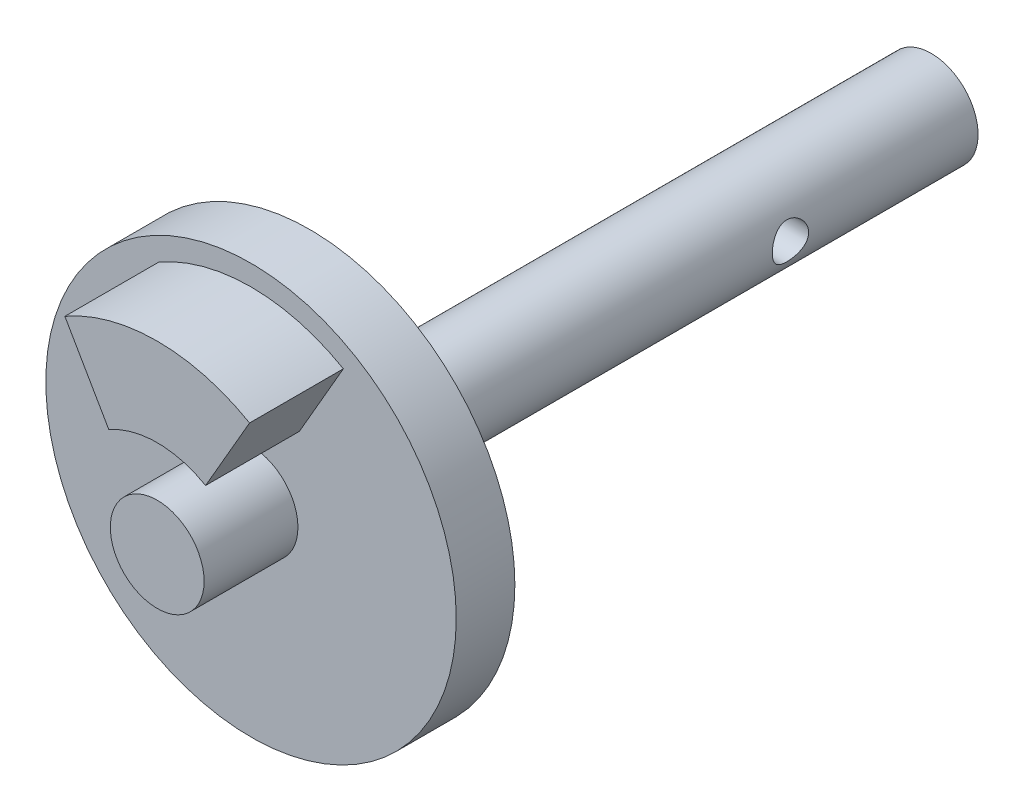
ISO-10303-21;
HEADER;
FILE_DESCRIPTION(('STEP AP214'),'2;1');
FILE_NAME('part.step','',(''),(''),'','','');
FILE_SCHEMA(('AUTOMOTIVE_DESIGN { 1 0 10303 214 1 1 1 1 }'));
ENDSEC;
DATA;
#1=APPLICATION_CONTEXT('core data for automotive mechanical design processes');
#2=APPLICATION_PROTOCOL_DEFINITION('international standard','automotive_design',2000,#1);
#3=PRODUCT_CONTEXT('',#1,'mechanical');
#4=PRODUCT('Part','Part','',(#3));
#5=PRODUCT_RELATED_PRODUCT_CATEGORY('part','',(#4));
#6=PRODUCT_DEFINITION_FORMATION('','',#4);
#7=PRODUCT_DEFINITION_CONTEXT('part definition',#1,'design');
#8=PRODUCT_DEFINITION('design','',#6,#7);
#9=PRODUCT_DEFINITION_SHAPE('','',#8);
#10=(LENGTH_UNIT() NAMED_UNIT(*) SI_UNIT(.MILLI.,.METRE.));
#11=(NAMED_UNIT(*) PLANE_ANGLE_UNIT() SI_UNIT($,.RADIAN.));
#12=(NAMED_UNIT(*) SI_UNIT($,.STERADIAN.) SOLID_ANGLE_UNIT());
#13=UNCERTAINTY_MEASURE_WITH_UNIT(LENGTH_MEASURE(1.E-05),#10,'distance_accuracy_value','');
#14=(GEOMETRIC_REPRESENTATION_CONTEXT(3) GLOBAL_UNCERTAINTY_ASSIGNED_CONTEXT((#13)) GLOBAL_UNIT_ASSIGNED_CONTEXT((#10,
#11,#12)) REPRESENTATION_CONTEXT('',''));
#15=CARTESIAN_POINT('',(0.,0.,0.));
#16=DIRECTION('',(0.,0.,1.));
#17=DIRECTION('',(1.,0.,0.));
#18=AXIS2_PLACEMENT_3D('',#15,#16,#17);
#19=CARTESIAN_POINT('',(0.,0.,2.5));
#20=DIRECTION('',(0.,0.,1.));
#21=DIRECTION('',(1.,0.,0.));
#22=AXIS2_PLACEMENT_3D('',#19,#20,#21);
#23=PLANE('',#22);
#24=CARTESIAN_POINT('',(0.,0.,2.5));
#25=DIRECTION('',(0.,0.,1.));
#26=DIRECTION('',(1.,0.,0.));
#27=AXIS2_PLACEMENT_3D('',#24,#25,#26);
#28=CIRCLE('',#27,4.);
#29=CARTESIAN_POINT('',(4.,0.,2.5));
#30=VERTEX_POINT('',#29);
#31=EDGE_CURVE('E188',#30,#30,#28,.T.);
#32=ORIENTED_EDGE('',*,*,#31,.F.);
#33=EDGE_LOOP('',(#32));
#34=FACE_BOUND('',#33,.T.);
#35=CARTESIAN_POINT('',(0.,0.,2.5));
#36=DIRECTION('',(0.,0.,1.));
#37=DIRECTION('',(1.,0.,0.));
#38=AXIS2_PLACEMENT_3D('',#35,#36,#37);
#39=CIRCLE('',#38,17.5);
#40=CARTESIAN_POINT('',(17.5,0.,2.5));
#41=VERTEX_POINT('',#40);
#42=EDGE_CURVE('E47',#41,#41,#39,.T.);
#43=ORIENTED_EDGE('',*,*,#42,.T.);
#44=EDGE_LOOP('',(#43));
#45=FACE_BOUND('',#44,.T.);
#46=DIRECTION('',(0.499999999999996,-0.866025403784441,0.));
#47=VECTOR('',#46,1.);
#48=CARTESIAN_POINT('',(-4.12499999999996,7.14470958122165,2.5));
#49=LINE('',#48,#47);
#50=CARTESIAN_POINT('',(-7.87499999999993,13.639900109605,2.5));
#51=VERTEX_POINT('',#50);
#52=CARTESIAN_POINT('',(-4.12499999999996,7.14470958122165,2.5));
#53=VERTEX_POINT('',#52);
#54=EDGE_CURVE('E96',#51,#53,#49,.T.);
#55=ORIENTED_EDGE('',*,*,#54,.F.);
#56=CARTESIAN_POINT('',(0.,0.,2.5));
#57=DIRECTION('',(0.,0.,1.));
#58=DIRECTION('',(-1.,0.,0.));
#59=AXIS2_PLACEMENT_3D('',#56,#57,#58);
#60=CIRCLE('',#59,15.75);
#61=CARTESIAN_POINT('',(7.87499999999993,13.639900109605,2.5));
#62=VERTEX_POINT('',#61);
#63=EDGE_CURVE('E107',#62,#51,#60,.T.);
#64=ORIENTED_EDGE('',*,*,#63,.F.);
#65=DIRECTION('',(0.499999999999995,0.866025403784441,0.));
#66=VECTOR('',#65,1.);
#67=CARTESIAN_POINT('',(7.87499999999993,13.639900109605,2.5));
#68=LINE('',#67,#66);
#69=CARTESIAN_POINT('',(4.12499999999996,7.14470958122164,2.5));
#70=VERTEX_POINT('',#69);
#71=EDGE_CURVE('E77',#70,#62,#68,.T.);
#72=ORIENTED_EDGE('',*,*,#71,.F.);
#73=CARTESIAN_POINT('',(0.,0.,2.5));
#74=DIRECTION('',(0.,0.,-1.));
#75=DIRECTION('',(1.,0.,0.));
#76=AXIS2_PLACEMENT_3D('',#73,#74,#75);
#77=CIRCLE('',#76,8.25);
#78=EDGE_CURVE('E112',#53,#70,#77,.T.);
#79=ORIENTED_EDGE('',*,*,#78,.F.);
#80=EDGE_LOOP('',(#55,#64,#72,#79));
#81=FACE_BOUND('',#80,.T.);
#82=ADVANCED_FACE('F38',(#34,#45,#81),#23,.T.);
#83=CARTESIAN_POINT('',(0.,0.,2.5));
#84=DIRECTION('',(0.,0.,-1.));
#85=DIRECTION('',(-1.,0.,0.));
#86=AXIS2_PLACEMENT_3D('',#83,#84,#85);
#87=CYLINDRICAL_SURFACE('',#86,17.5);
#88=ORIENTED_EDGE('',*,*,#42,.F.);
#89=EDGE_LOOP('',(#88));
#90=FACE_BOUND('',#89,.T.);
#91=CARTESIAN_POINT('',(0.,0.,-2.5));
#92=DIRECTION('',(0.,0.,1.));
#93=DIRECTION('',(1.,0.,0.));
#94=AXIS2_PLACEMENT_3D('',#91,#92,#93);
#95=CIRCLE('',#94,17.5);
#96=CARTESIAN_POINT('',(17.5,0.,-2.5));
#97=VERTEX_POINT('',#96);
#98=EDGE_CURVE('E42',#97,#97,#95,.T.);
#99=ORIENTED_EDGE('',*,*,#98,.T.);
#100=EDGE_LOOP('',(#99));
#101=FACE_BOUND('',#100,.T.);
#102=ADVANCED_FACE('F40',(#90,#101),#87,.T.);
#103=CARTESIAN_POINT('',(0.,0.,-2.5));
#104=DIRECTION('',(0.,0.,1.));
#105=DIRECTION('',(1.,0.,0.));
#106=AXIS2_PLACEMENT_3D('',#103,#104,#105);
#107=PLANE('',#106);
#108=CARTESIAN_POINT('',(0.,0.,-2.5));
#109=DIRECTION('',(0.,0.,-1.));
#110=DIRECTION('',(-1.,0.,0.));
#111=AXIS2_PLACEMENT_3D('',#108,#109,#110);
#112=CIRCLE('',#111,4.);
#113=CARTESIAN_POINT('',(-4.,0.,-2.5));
#114=VERTEX_POINT('',#113);
#115=EDGE_CURVE('E11',#114,#114,#112,.T.);
#116=ORIENTED_EDGE('',*,*,#115,.F.);
#117=EDGE_LOOP('',(#116));
#118=FACE_BOUND('',#117,.T.);
#119=ORIENTED_EDGE('',*,*,#98,.F.);
#120=EDGE_LOOP('',(#119));
#121=FACE_BOUND('',#120,.T.);
#122=ADVANCED_FACE('F124',(#118,#121),#107,.F.);
#123=CARTESIAN_POINT('',(0.,0.,10.5));
#124=DIRECTION('',(0.,0.,-1.));
#125=DIRECTION('',(-1.,0.,0.));
#126=AXIS2_PLACEMENT_3D('',#123,#124,#125);
#127=CYLINDRICAL_SURFACE('',#126,15.75);
#128=ORIENTED_EDGE('',*,*,#63,.T.);
#129=DIRECTION('',(0.,0.,-1.));
#130=VECTOR('',#129,1.);
#131=CARTESIAN_POINT('',(-7.87499999999993,13.639900109605,10.5));
#132=LINE('',#131,#130);
#133=CARTESIAN_POINT('',(-7.87499999999993,13.639900109605,10.5));
#134=VERTEX_POINT('',#133);
#135=EDGE_CURVE('E99',#134,#51,#132,.T.);
#136=ORIENTED_EDGE('',*,*,#135,.F.);
#137=CARTESIAN_POINT('',(0.,0.,10.5));
#138=DIRECTION('',(0.,0.,1.));
#139=DIRECTION('',(-1.,0.,0.));
#140=AXIS2_PLACEMENT_3D('',#137,#138,#139);
#141=CIRCLE('',#140,15.75);
#142=CARTESIAN_POINT('',(7.87499999999993,13.639900109605,10.5));
#143=VERTEX_POINT('',#142);
#144=EDGE_CURVE('E89',#143,#134,#141,.T.);
#145=ORIENTED_EDGE('',*,*,#144,.F.);
#146=DIRECTION('',(0.,0.,-1.));
#147=VECTOR('',#146,1.);
#148=CARTESIAN_POINT('',(7.87499999999993,13.639900109605,10.5));
#149=LINE('',#148,#147);
#150=EDGE_CURVE('E103',#143,#62,#149,.T.);
#151=ORIENTED_EDGE('',*,*,#150,.T.);
#152=EDGE_LOOP('',(#128,#136,#145,#151));
#153=FACE_BOUND('',#152,.T.);
#154=ADVANCED_FACE('F126',(#153),#127,.T.);
#155=CARTESIAN_POINT('',(-4.12499999999996,7.14470958122165,10.5));
#156=DIRECTION('',(0.866025403784441,0.499999999999996,0.));
#157=DIRECTION('',(-0.499999999999996,0.866025403784441,0.));
#158=AXIS2_PLACEMENT_3D('',#155,#156,#157);
#159=PLANE('',#158);
#160=ORIENTED_EDGE('',*,*,#54,.T.);
#161=DIRECTION('',(0.,0.,-1.));
#162=VECTOR('',#161,1.);
#163=CARTESIAN_POINT('',(-4.12499999999996,7.14470958122165,10.5));
#164=LINE('',#163,#162);
#165=CARTESIAN_POINT('',(-4.12499999999996,7.14470958122165,10.5));
#166=VERTEX_POINT('',#165);
#167=EDGE_CURVE('E93',#166,#53,#164,.T.);
#168=ORIENTED_EDGE('',*,*,#167,.F.);
#169=DIRECTION('',(0.499999999999996,-0.866025403784441,0.));
#170=VECTOR('',#169,1.);
#171=CARTESIAN_POINT('',(-4.12499999999996,7.14470958122165,10.5));
#172=LINE('',#171,#170);
#173=EDGE_CURVE('E84',#134,#166,#172,.T.);
#174=ORIENTED_EDGE('',*,*,#173,.F.);
#175=ORIENTED_EDGE('',*,*,#135,.T.);
#176=EDGE_LOOP('',(#160,#168,#174,#175));
#177=FACE_BOUND('',#176,.T.);
#178=ADVANCED_FACE('F94',(#177),#159,.F.);
#179=CARTESIAN_POINT('',(0.,0.,10.5));
#180=DIRECTION('',(0.,0.,-1.));
#181=DIRECTION('',(-1.,0.,0.));
#182=AXIS2_PLACEMENT_3D('',#179,#180,#181);
#183=CYLINDRICAL_SURFACE('',#182,8.25);
#184=ORIENTED_EDGE('',*,*,#78,.T.);
#185=DIRECTION('',(0.,0.,-1.));
#186=VECTOR('',#185,1.);
#187=CARTESIAN_POINT('',(4.12499999999996,7.14470958122164,10.5));
#188=LINE('',#187,#186);
#189=CARTESIAN_POINT('',(4.12499999999996,7.14470958122164,10.5));
#190=VERTEX_POINT('',#189);
#191=EDGE_CURVE('E55',#190,#70,#188,.T.);
#192=ORIENTED_EDGE('',*,*,#191,.F.);
#193=CARTESIAN_POINT('',(0.,0.,10.5));
#194=DIRECTION('',(0.,0.,-1.));
#195=DIRECTION('',(1.,0.,0.));
#196=AXIS2_PLACEMENT_3D('',#193,#194,#195);
#197=CIRCLE('',#196,8.25);
#198=EDGE_CURVE('E87',#166,#190,#197,.T.);
#199=ORIENTED_EDGE('',*,*,#198,.F.);
#200=ORIENTED_EDGE('',*,*,#167,.T.);
#201=EDGE_LOOP('',(#184,#192,#199,#200));
#202=FACE_BOUND('',#201,.T.);
#203=ADVANCED_FACE('F101',(#202),#183,.F.);
#204=CARTESIAN_POINT('',(7.87499999999993,13.639900109605,10.5));
#205=DIRECTION('',(-0.866025403784441,0.499999999999995,0.));
#206=DIRECTION('',(-0.499999999999995,-0.866025403784441,0.));
#207=AXIS2_PLACEMENT_3D('',#204,#205,#206);
#208=PLANE('',#207);
#209=ORIENTED_EDGE('',*,*,#71,.T.);
#210=ORIENTED_EDGE('',*,*,#150,.F.);
#211=DIRECTION('',(0.499999999999995,0.866025403784441,0.));
#212=VECTOR('',#211,1.);
#213=CARTESIAN_POINT('',(7.87499999999993,13.639900109605,10.5));
#214=LINE('',#213,#212);
#215=EDGE_CURVE('E63',#190,#143,#214,.T.);
#216=ORIENTED_EDGE('',*,*,#215,.F.);
#217=ORIENTED_EDGE('',*,*,#191,.T.);
#218=EDGE_LOOP('',(#209,#210,#216,#217));
#219=FACE_BOUND('',#218,.T.);
#220=ADVANCED_FACE('F147',(#219),#208,.F.);
#221=CARTESIAN_POINT('',(0.,0.,10.5));
#222=DIRECTION('',(0.,0.,-1.));
#223=DIRECTION('',(-1.,0.,0.));
#224=AXIS2_PLACEMENT_3D('',#221,#222,#223);
#225=PLANE('',#224);
#226=ORIENTED_EDGE('',*,*,#144,.T.);
#227=ORIENTED_EDGE('',*,*,#173,.T.);
#228=ORIENTED_EDGE('',*,*,#198,.T.);
#229=ORIENTED_EDGE('',*,*,#215,.T.);
#230=EDGE_LOOP('',(#226,#227,#228,#229));
#231=FACE_BOUND('',#230,.T.);
#232=ADVANCED_FACE('F85',(#231),#225,.F.);
#233=CARTESIAN_POINT('',(0.,0.,10.5));
#234=DIRECTION('',(0.,0.,-1.));
#235=DIRECTION('',(-1.,0.,0.));
#236=AXIS2_PLACEMENT_3D('',#233,#234,#235);
#237=CYLINDRICAL_SURFACE('',#236,4.);
#238=CARTESIAN_POINT('',(0.,0.,10.5));
#239=DIRECTION('',(0.,0.,1.));
#240=DIRECTION('',(1.,0.,0.));
#241=AXIS2_PLACEMENT_3D('',#238,#239,#240);
#242=CIRCLE('',#241,4.);
#243=CARTESIAN_POINT('',(4.,0.,10.5));
#244=VERTEX_POINT('',#243);
#245=EDGE_CURVE('E110',#244,#244,#242,.T.);
#246=ORIENTED_EDGE('',*,*,#245,.F.);
#247=EDGE_LOOP('',(#246));
#248=FACE_BOUND('',#247,.T.);
#249=ORIENTED_EDGE('',*,*,#31,.T.);
#250=EDGE_LOOP('',(#249));
#251=FACE_BOUND('',#250,.T.);
#252=ADVANCED_FACE('F152',(#248,#251),#237,.T.);
#253=CARTESIAN_POINT('',(0.,0.,10.5));
#254=DIRECTION('',(0.,0.,1.));
#255=DIRECTION('',(1.,0.,0.));
#256=AXIS2_PLACEMENT_3D('',#253,#254,#255);
#257=PLANE('',#256);
#258=ORIENTED_EDGE('',*,*,#245,.T.);
#259=EDGE_LOOP('',(#258));
#260=FACE_BOUND('',#259,.T.);
#261=ADVANCED_FACE('F155',(#260),#257,.T.);
#262=CARTESIAN_POINT('',(0.,0.,-55.5));
#263=DIRECTION('',(0.,0.,1.));
#264=DIRECTION('',(1.,0.,0.));
#265=AXIS2_PLACEMENT_3D('',#262,#263,#264);
#266=CYLINDRICAL_SURFACE('',#265,4.);
#267=CARTESIAN_POINT('',(4.,0.,-37.95));
#268=CARTESIAN_POINT('',(4.00000307103966,-0.0837418170105693,-37.9499959912669));
#269=CARTESIAN_POINT('',(3.9973478314409,-0.167457172373491,-37.9568073370164));
#270=CARTESIAN_POINT('',(3.98702237503302,-0.332375207740033,-37.9837535651346));
#271=CARTESIAN_POINT('',(3.97935324557983,-0.413578428549003,-38.0038855586827));
#272=CARTESIAN_POINT('',(3.95981985493208,-0.571068953775959,-38.0566468806909));
#273=CARTESIAN_POINT('',(3.94796402326925,-0.647365774547914,-38.0892511083804));
#274=CARTESIAN_POINT('',(3.92122905980691,-0.793397990414406,-38.1658992097388));
#275=CARTESIAN_POINT('',(3.9063490629407,-0.863131499694842,-38.2099463576765));
#276=CARTESIAN_POINT('',(3.8743461117322,-0.997188457700879,-38.310291412028));
#277=CARTESIAN_POINT('',(3.85715676295881,-1.06117882783834,-38.3670129043513));
#278=CARTESIAN_POINT('',(3.82278777553389,-1.17901131840263,-38.4901972993996));
#279=CARTESIAN_POINT('',(3.80560814209105,-1.23285001917139,-38.5566634713313));
#280=CARTESIAN_POINT('',(3.77241707577085,-1.33104129410195,-38.7007885546201));
#281=CARTESIAN_POINT('',(3.75648304078581,-1.37491107737843,-38.7787960202178));
#282=CARTESIAN_POINT('',(3.7286279787642,-1.44875905604124,-38.9417951377925));
#283=CARTESIAN_POINT('',(3.71670522553814,-1.47874322896953,-39.0267837659002));
#284=CARTESIAN_POINT('',(3.69893619719526,-1.52263359505667,-39.1974891860113));
#285=CARTESIAN_POINT('',(3.69284964987085,-1.53717845025293,-39.2830158816512));
#286=CARTESIAN_POINT('',(3.686742208991,-1.55177347407324,-39.4554960385706));
#287=CARTESIAN_POINT('',(3.68671858716909,-1.55183016225289,-39.5424488404975));
#288=CARTESIAN_POINT('',(3.69253360906918,-1.53793335557095,-39.7093281950036));
#289=CARTESIAN_POINT('',(3.69799366796117,-1.52488463668498,-39.789345788942));
#290=CARTESIAN_POINT('',(3.71352858031644,-1.48664952044108,-39.9459514443488));
#291=CARTESIAN_POINT('',(3.72360417780325,-1.46146116614316,-40.022538950702));
#292=CARTESIAN_POINT('',(3.74745019933858,-1.39919376657937,-40.1718880912395));
#293=CARTESIAN_POINT('',(3.76128946343745,-1.36189037494605,-40.2445447113113));
#294=CARTESIAN_POINT('',(3.79108253096821,-1.27660867855489,-40.3828221029892));
#295=CARTESIAN_POINT('',(3.80703709727107,-1.22862651830679,-40.4484403207197));
#296=CARTESIAN_POINT('',(3.84066621512758,-1.1192765867249,-40.5757594849997));
#297=CARTESIAN_POINT('',(3.85838181074213,-1.05719282693901,-40.6368362299683));
#298=CARTESIAN_POINT('',(3.89255270828944,-0.923467184299243,-40.7479039907166));
#299=CARTESIAN_POINT('',(3.90900778906909,-0.85182363022969,-40.7978930641044));
#300=CARTESIAN_POINT('',(3.93917140871768,-0.699332321527985,-40.8861183716676));
#301=CARTESIAN_POINT('',(3.95282680746144,-0.618345361125568,-40.9241334745914));
#302=CARTESIAN_POINT('',(3.97545468791428,-0.4504635775242,-40.9857887686004));
#303=CARTESIAN_POINT('',(3.98442939616062,-0.363571585538861,-41.0094357952583));
#304=CARTESIAN_POINT('',(3.99628616226532,-0.19158931053644,-41.0404530006203));
#305=CARTESIAN_POINT('',(3.99948214473611,-0.106672001209173,-41.0486628854415));
#306=CARTESIAN_POINT('',(4.0004007065522,0.0633780229217712,-41.0510347826259));
#307=CARTESIAN_POINT('',(3.99812459874478,0.148510681164301,-41.0452001645032));
#308=CARTESIAN_POINT('',(3.98856115851297,0.312858974622368,-41.0202769681641));
#309=CARTESIAN_POINT('',(3.98148622105735,0.392173433269957,-41.0017498230045));
#310=CARTESIAN_POINT('',(3.96325324682584,0.546503715363223,-40.9527188621209));
#311=CARTESIAN_POINT('',(3.95209468123897,0.621518980627428,-40.9222134952352));
#312=CARTESIAN_POINT('',(3.92637006174119,0.767652849526817,-40.8491052490632));
#313=CARTESIAN_POINT('',(3.91171167856455,0.838586587400798,-40.8061663467448));
#314=CARTESIAN_POINT('',(3.88059327622917,0.972485884255152,-40.7097860587091));
#315=CARTESIAN_POINT('',(3.86413256303816,1.03544835343259,-40.6563406208415));
#316=CARTESIAN_POINT('',(3.82994670072775,1.15570630052789,-40.5365723031989));
#317=CARTESIAN_POINT('',(3.81220642219352,1.21240855982172,-40.4696565417085));
#318=CARTESIAN_POINT('',(3.7784267775271,1.31391042842011,-40.3269269853336));
#319=CARTESIAN_POINT('',(3.76238762343854,1.35870855493065,-40.2511120836549));
#320=CARTESIAN_POINT('',(3.73385097634257,1.43528626427412,-40.0918671555308));
#321=CARTESIAN_POINT('',(3.72137804867911,1.46697619056479,-40.008389307021));
#322=CARTESIAN_POINT('',(3.70183589219826,1.5156224699213,-39.8366581746143));
#323=CARTESIAN_POINT('',(3.69476300684656,1.53258879385557,-39.7484081655293));
#324=CARTESIAN_POINT('',(3.68732874278393,1.55038415337445,-39.5761139440912));
#325=CARTESIAN_POINT('',(3.68654305278754,1.55223359693949,-39.4921926662731));
#326=CARTESIAN_POINT('',(3.69067248938598,1.54238929517269,-39.3252993720319));
#327=CARTESIAN_POINT('',(3.69558699502441,1.53069702502094,-39.2423272532053));
#328=CARTESIAN_POINT('',(3.71019928004618,1.49491544189353,-39.0826341038896));
#329=CARTESIAN_POINT('',(3.7197245672776,1.471271918625,-39.0057960104313));
#330=CARTESIAN_POINT('',(3.74237408260303,1.41266354169454,-38.8571392320299));
#331=CARTESIAN_POINT('',(3.7554992479164,1.37769573935543,-38.785321860338));
#332=CARTESIAN_POINT('',(3.7847652300439,1.29520837732455,-38.6444543844358));
#333=CARTESIAN_POINT('',(3.80103203424639,1.24710518862183,-38.5757725769274));
#334=CARTESIAN_POINT('',(3.83434014261162,1.14059071312121,-38.4471315013078));
#335=CARTESIAN_POINT('',(3.85138169981625,1.08217604027141,-38.3871751102561));
#336=CARTESIAN_POINT('',(3.88553398671661,0.952559682216143,-38.2740486026689));
#337=CARTESIAN_POINT('',(3.90258881429735,0.880804909103501,-38.221492300489));
#338=CARTESIAN_POINT('',(3.93379551376096,0.72887849522307,-38.1291833822372));
#339=CARTESIAN_POINT('',(3.94794681660584,0.648705209225503,-38.0894332750778));
#340=CARTESIAN_POINT('',(3.97259068830064,0.476070144268097,-38.021809120905));
#341=CARTESIAN_POINT('',(3.98274647341979,0.383139212843743,-37.9949961978748));
#342=CARTESIAN_POINT('',(3.99644738728565,0.19345888362943,-37.9590992319309));
#343=CARTESIAN_POINT('',(3.99999645331605,0.0967117952157216,-37.9500046296079));
#344=CARTESIAN_POINT('',(4.,0.,-37.95));
#345=B_SPLINE_CURVE_WITH_KNOTS('',3,(#267,#268,#269,#270,#271,#272,#273,#274,#275,#276,#277,
#278,#279,#280,#281,#282,#283,#284,#285,#286,#287,#288,#289,#290,#291,#292,#293,#294,#295,#296,
#297,#298,#299,#300,#301,#302,#303,#304,#305,#306,#307,#308,#309,#310,#311,#312,#313,#314,#315,
#316,#317,#318,#319,#320,#321,#322,#323,#324,#325,#326,#327,#328,#329,#330,#331,#332,#333,#334,
#335,#336,#337,#338,#339,#340,#341,#342,#343,#344),.UNSPECIFIED.,.T.,.F.,(4,2,2,2,2,2,2,2,2,2,2,
2,2,2,2,2,2,2,2,2,2,2,2,2,2,2,2,2,2,2,2,2,2,2,2,2,2,2,4),(0.,0.250868506659483,
0.501682625822805,0.751994606804863,1.00237829091529,1.26289324584923,1.52349580083106,
1.79484593304449,2.06607914435899,2.32559405583376,2.58499218753425,2.82763403872307,
3.07031501748276,3.31777403042842,3.5653225319728,3.83073141369118,4.09618675436141,
4.36629046146056,4.63626556664625,4.89107530662836,5.14582391953313,5.3899755248779,
5.63415875792246,5.88568062986169,6.1372996995035,6.4045161155511,6.67176580083182,
6.94081432578585,7.20968050775753,7.46023414456831,7.71076048963594,7.95256448228419,
8.19443148785929,8.44957507206159,8.70480259588003,8.9751752520618,9.24560084585601,
9.53549682269167,9.82521998022793),.UNSPECIFIED.);
#346=CARTESIAN_POINT('',(4.,0.,-37.95));
#347=VERTEX_POINT('',#346);
#348=EDGE_CURVE('E174',#347,#347,#345,.T.);
#349=ORIENTED_EDGE('',*,*,#348,.F.);
#350=EDGE_LOOP('',(#349));
#351=FACE_BOUND('',#350,.T.);
#352=CARTESIAN_POINT('',(-4.,0.,-41.05));
#353=CARTESIAN_POINT('',(-4.00000307103966,0.0837418170105693,-41.0500040087332));
#354=CARTESIAN_POINT('',(-3.9973478314409,0.167457172373491,-41.0431926629836));
#355=CARTESIAN_POINT('',(-3.98702237503302,0.332375207740033,-41.0162464348654));
#356=CARTESIAN_POINT('',(-3.97935324557983,0.413578428549003,-40.9961144413173));
#357=CARTESIAN_POINT('',(-3.95981985493208,0.571068953775959,-40.9433531193091));
#358=CARTESIAN_POINT('',(-3.94796402326925,0.647365774547914,-40.9107488916196));
#359=CARTESIAN_POINT('',(-3.92122905980691,0.793397990414406,-40.8341007902612));
#360=CARTESIAN_POINT('',(-3.9063490629407,0.863131499694842,-40.7900536423235));
#361=CARTESIAN_POINT('',(-3.8743461117322,0.997188457700879,-40.689708587972));
#362=CARTESIAN_POINT('',(-3.85715676295881,1.06117882783834,-40.6329870956487));
#363=CARTESIAN_POINT('',(-3.82278777553389,1.17901131840263,-40.5098027006004));
#364=CARTESIAN_POINT('',(-3.80560814209105,1.23285001917139,-40.4433365286688));
#365=CARTESIAN_POINT('',(-3.77241707577085,1.33104129410195,-40.2992114453799));
#366=CARTESIAN_POINT('',(-3.75648304078581,1.37491107737843,-40.2212039797822));
#367=CARTESIAN_POINT('',(-3.7286279787642,1.44875905604124,-40.0582048622075));
#368=CARTESIAN_POINT('',(-3.71670522553814,1.47874322896953,-39.9732162340998));
#369=CARTESIAN_POINT('',(-3.69893619719526,1.52263359505667,-39.8025108139888));
#370=CARTESIAN_POINT('',(-3.69284964987085,1.53717845025293,-39.7169841183488));
#371=CARTESIAN_POINT('',(-3.686742208991,1.55177347407324,-39.5445039614294));
#372=CARTESIAN_POINT('',(-3.68671858716909,1.55183016225289,-39.4575511595025));
#373=CARTESIAN_POINT('',(-3.69253360906918,1.53793335557095,-39.2906718049964));
#374=CARTESIAN_POINT('',(-3.69799366796117,1.52488463668498,-39.210654211058));
#375=CARTESIAN_POINT('',(-3.71352858031644,1.48664952044108,-39.0540485556512));
#376=CARTESIAN_POINT('',(-3.72360417780325,1.46146116614316,-38.977461049298));
#377=CARTESIAN_POINT('',(-3.74745019933858,1.39919376657937,-38.8281119087606));
#378=CARTESIAN_POINT('',(-3.76128946343745,1.36189037494605,-38.7554552886887));
#379=CARTESIAN_POINT('',(-3.79108253096821,1.27660867855489,-38.6171778970109));
#380=CARTESIAN_POINT('',(-3.80703709727107,1.22862651830679,-38.5515596792803));
#381=CARTESIAN_POINT('',(-3.84066621512758,1.1192765867249,-38.4242405150004));
#382=CARTESIAN_POINT('',(-3.85838181074213,1.05719282693901,-38.3631637700317));
#383=CARTESIAN_POINT('',(-3.89255270828944,0.923467184299243,-38.2520960092834));
#384=CARTESIAN_POINT('',(-3.90900778906909,0.85182363022969,-38.2021069358957));
#385=CARTESIAN_POINT('',(-3.93917140871768,0.699332321527985,-38.1138816283324));
#386=CARTESIAN_POINT('',(-3.95282680746144,0.618345361125568,-38.0758665254086));
#387=CARTESIAN_POINT('',(-3.97545468791428,0.450463577524199,-38.0142112313996));
#388=CARTESIAN_POINT('',(-3.98442939616062,0.363571585538861,-37.9905642047417));
#389=CARTESIAN_POINT('',(-3.99628616226532,0.19158931053644,-37.9595469993797));
#390=CARTESIAN_POINT('',(-3.99948214473611,0.106672001209173,-37.9513371145585));
#391=CARTESIAN_POINT('',(-4.0004007065522,-0.0633780229217712,-37.9489652173741));
#392=CARTESIAN_POINT('',(-3.99812459874478,-0.148510681164301,-37.9547998354968));
#393=CARTESIAN_POINT('',(-3.98856115851297,-0.312858974622368,-37.9797230318359));
#394=CARTESIAN_POINT('',(-3.98148622105735,-0.392173433269957,-37.9982501769955));
#395=CARTESIAN_POINT('',(-3.96325324682584,-0.546503715363223,-38.0472811378791));
#396=CARTESIAN_POINT('',(-3.95209468123897,-0.621518980627428,-38.0777865047648));
#397=CARTESIAN_POINT('',(-3.92637006174119,-0.767652849526817,-38.1508947509368));
#398=CARTESIAN_POINT('',(-3.91171167856455,-0.838586587400798,-38.1938336532552));
#399=CARTESIAN_POINT('',(-3.88059327622917,-0.972485884255152,-38.2902139412909));
#400=CARTESIAN_POINT('',(-3.86413256303816,-1.03544835343259,-38.3436593791585));
#401=CARTESIAN_POINT('',(-3.82994670072775,-1.1557063005279,-38.4634276968011));
#402=CARTESIAN_POINT('',(-3.81220642219352,-1.21240855982172,-38.5303434582915));
#403=CARTESIAN_POINT('',(-3.7784267775271,-1.31391042842011,-38.6730730146664));
#404=CARTESIAN_POINT('',(-3.76238762343853,-1.35870855493065,-38.7488879163451));
#405=CARTESIAN_POINT('',(-3.73385097634257,-1.43528626427412,-38.9081328444692));
#406=CARTESIAN_POINT('',(-3.72137804867911,-1.4669761905648,-38.991610692979));
#407=CARTESIAN_POINT('',(-3.70183589219826,-1.5156224699213,-39.1633418253857));
#408=CARTESIAN_POINT('',(-3.69476300684656,-1.53258879385557,-39.2515918344708));
#409=CARTESIAN_POINT('',(-3.68732874278393,-1.55038415337445,-39.4238860559089));
#410=CARTESIAN_POINT('',(-3.68654305278754,-1.55223359693949,-39.5078073337269));
#411=CARTESIAN_POINT('',(-3.69067248938598,-1.54238929517269,-39.6747006279681));
#412=CARTESIAN_POINT('',(-3.69558699502441,-1.53069702502094,-39.7576727467947));
#413=CARTESIAN_POINT('',(-3.71019928004618,-1.49491544189353,-39.9173658961104));
#414=CARTESIAN_POINT('',(-3.7197245672776,-1.471271918625,-39.9942039895688));
#415=CARTESIAN_POINT('',(-3.74237408260303,-1.41266354169454,-40.1428607679701));
#416=CARTESIAN_POINT('',(-3.7554992479164,-1.37769573935543,-40.214678139662));
#417=CARTESIAN_POINT('',(-3.7847652300439,-1.29520837732455,-40.3555456155642));
#418=CARTESIAN_POINT('',(-3.80103203424639,-1.24710518862183,-40.4242274230726));
#419=CARTESIAN_POINT('',(-3.83434014261162,-1.14059071312121,-40.5528684986922));
#420=CARTESIAN_POINT('',(-3.85138169981625,-1.08217604027141,-40.6128248897439));
#421=CARTESIAN_POINT('',(-3.88553398671661,-0.952559682216143,-40.7259513973311));
#422=CARTESIAN_POINT('',(-3.90258881429735,-0.880804909103501,-40.778507699511));
#423=CARTESIAN_POINT('',(-3.93379551376096,-0.72887849522307,-40.8708166177628));
#424=CARTESIAN_POINT('',(-3.94794681660584,-0.648705209225503,-40.9105667249222));
#425=CARTESIAN_POINT('',(-3.97259068830064,-0.476070144268097,-40.978190879095));
#426=CARTESIAN_POINT('',(-3.98274647341979,-0.383139212843743,-41.0050038021252));
#427=CARTESIAN_POINT('',(-3.99644738728565,-0.19345888362943,-41.0409007680692));
#428=CARTESIAN_POINT('',(-3.99999645331605,-0.0967117952157216,-41.0499953703921));
#429=CARTESIAN_POINT('',(-4.,0.,-41.05));
#430=B_SPLINE_CURVE_WITH_KNOTS('',3,(#352,#353,#354,#355,#356,#357,#358,#359,#360,#361,#362,
#363,#364,#365,#366,#367,#368,#369,#370,#371,#372,#373,#374,#375,#376,#377,#378,#379,#380,#381,
#382,#383,#384,#385,#386,#387,#388,#389,#390,#391,#392,#393,#394,#395,#396,#397,#398,#399,#400,
#401,#402,#403,#404,#405,#406,#407,#408,#409,#410,#411,#412,#413,#414,#415,#416,#417,#418,#419,
#420,#421,#422,#423,#424,#425,#426,#427,#428,#429),.UNSPECIFIED.,.T.,.F.,(4,2,2,2,2,2,2,2,2,2,2,
2,2,2,2,2,2,2,2,2,2,2,2,2,2,2,2,2,2,2,2,2,2,2,2,2,2,2,4),(0.,0.250868506659483,
0.501682625822805,0.751994606804863,1.00237829091529,1.26289324584923,1.52349580083106,
1.79484593304449,2.06607914435899,2.32559405583376,2.58499218753425,2.82763403872307,
3.07031501748276,3.31777403042842,3.5653225319728,3.83073141369118,4.09618675436141,
4.36629046146056,4.63626556664625,4.89107530662836,5.14582391953313,5.3899755248779,
5.63415875792246,5.88568062986169,6.1372996995035,6.4045161155511,6.67176580083182,
6.94081432578586,7.20968050775753,7.46023414456831,7.71076048963594,7.95256448228419,
8.19443148785929,8.44957507206159,8.70480259588003,8.9751752520618,9.24560084585601,
9.53549682269167,9.82521998022793),.UNSPECIFIED.);
#431=CARTESIAN_POINT('',(-4.,0.,-41.05));
#432=VERTEX_POINT('',#431);
#433=EDGE_CURVE('E182',#432,#432,#430,.T.);
#434=ORIENTED_EDGE('',*,*,#433,.T.);
#435=EDGE_LOOP('',(#434));
#436=FACE_BOUND('',#435,.T.);
#437=CARTESIAN_POINT('',(0.,0.,-55.5));
#438=DIRECTION('',(0.,0.,-1.));
#439=DIRECTION('',(-1.,0.,0.));
#440=AXIS2_PLACEMENT_3D('',#437,#438,#439);
#441=CIRCLE('',#440,4.);
#442=CARTESIAN_POINT('',(-4.,0.,-55.5));
#443=VERTEX_POINT('',#442);
#444=EDGE_CURVE('E181',#443,#443,#441,.T.);
#445=ORIENTED_EDGE('',*,*,#444,.F.);
#446=EDGE_LOOP('',(#445));
#447=FACE_BOUND('',#446,.T.);
#448=ORIENTED_EDGE('',*,*,#115,.T.);
#449=EDGE_LOOP('',(#448));
#450=FACE_BOUND('',#449,.T.);
#451=ADVANCED_FACE('F159',(#351,#436,#447,#450),#266,.T.);
#452=CARTESIAN_POINT('',(0.,0.,-55.5));
#453=DIRECTION('',(0.,0.,-1.));
#454=DIRECTION('',(-1.,0.,0.));
#455=AXIS2_PLACEMENT_3D('',#452,#453,#454);
#456=PLANE('',#455);
#457=ORIENTED_EDGE('',*,*,#444,.T.);
#458=EDGE_LOOP('',(#457));
#459=FACE_BOUND('',#458,.T.);
#460=ADVANCED_FACE('F163',(#459),#456,.T.);
#461=CARTESIAN_POINT('',(17.501,0.,-39.5));
#462=DIRECTION('',(-1.,0.,0.));
#463=DIRECTION('',(0.,0.,1.));
#464=AXIS2_PLACEMENT_3D('',#461,#462,#463);
#465=CYLINDRICAL_SURFACE('',#464,1.55);
#466=ORIENTED_EDGE('',*,*,#348,.T.);
#467=EDGE_LOOP('',(#466));
#468=FACE_BOUND('',#467,.T.);
#469=ORIENTED_EDGE('',*,*,#433,.F.);
#470=EDGE_LOOP('',(#469));
#471=FACE_BOUND('',#470,.T.);
#472=ADVANCED_FACE('F167',(#468,#471),#465,.F.);
#473=CLOSED_SHELL('',(#82,#102,#122,#154,#178,#203,#220,#232,#252,#261,#451,#460,#472));
#474=MANIFOLD_SOLID_BREP('B2',#473);
#475=ADVANCED_BREP_SHAPE_REPRESENTATION('',(#18,#474),#14);
#476=SHAPE_DEFINITION_REPRESENTATION(#9,#475);
ENDSEC;
END-ISO-10303-21;
